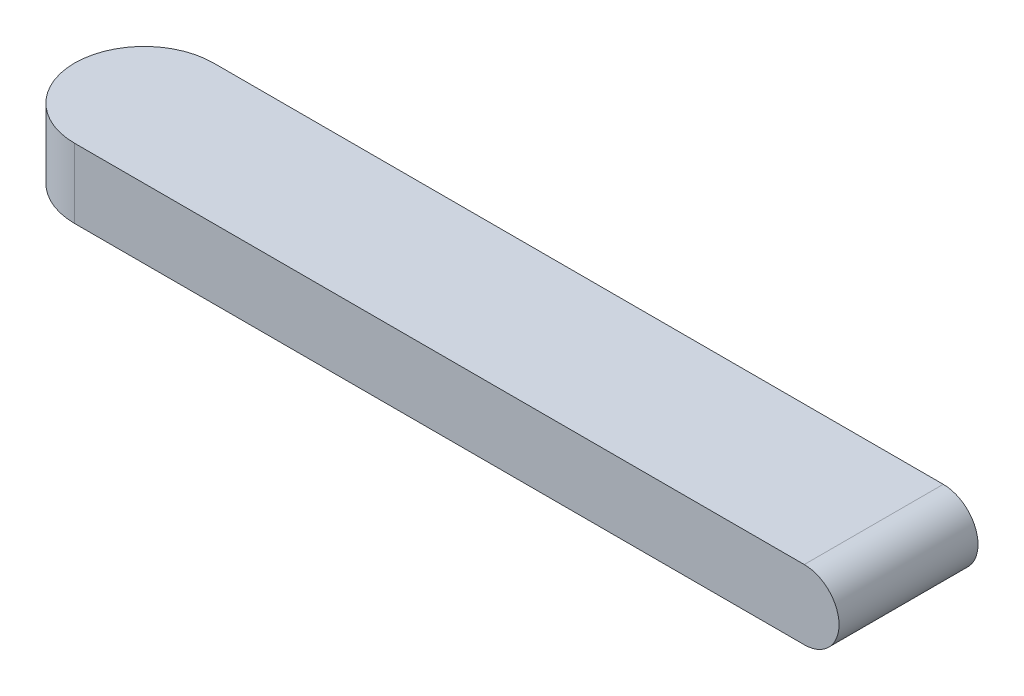
ISO-10303-21;
HEADER;
FILE_DESCRIPTION(('STEP AP214'),'2;1');
FILE_NAME('part.step','',(''),(''),'','','');
FILE_SCHEMA(('AUTOMOTIVE_DESIGN { 1 0 10303 214 1 1 1 1 }'));
ENDSEC;
DATA;
#1=APPLICATION_CONTEXT('core data for automotive mechanical design processes');
#2=APPLICATION_PROTOCOL_DEFINITION('international standard','automotive_design',2000,#1);
#3=PRODUCT_CONTEXT('',#1,'mechanical');
#4=PRODUCT('Part','Part','',(#3));
#5=PRODUCT_RELATED_PRODUCT_CATEGORY('part','',(#4));
#6=PRODUCT_DEFINITION_FORMATION('','',#4);
#7=PRODUCT_DEFINITION_CONTEXT('part definition',#1,'design');
#8=PRODUCT_DEFINITION('design','',#6,#7);
#9=PRODUCT_DEFINITION_SHAPE('','',#8);
#10=(LENGTH_UNIT() NAMED_UNIT(*) SI_UNIT(.MILLI.,.METRE.));
#11=(NAMED_UNIT(*) PLANE_ANGLE_UNIT() SI_UNIT($,.RADIAN.));
#12=(NAMED_UNIT(*) SI_UNIT($,.STERADIAN.) SOLID_ANGLE_UNIT());
#13=UNCERTAINTY_MEASURE_WITH_UNIT(LENGTH_MEASURE(1.E-05),#10,'distance_accuracy_value','');
#14=(GEOMETRIC_REPRESENTATION_CONTEXT(3) GLOBAL_UNCERTAINTY_ASSIGNED_CONTEXT((#13)) GLOBAL_UNIT_ASSIGNED_CONTEXT((#10,
#11,#12)) REPRESENTATION_CONTEXT('',''));
#15=CARTESIAN_POINT('',(0.,0.,0.));
#16=DIRECTION('',(0.,0.,1.));
#17=DIRECTION('',(1.,0.,0.));
#18=AXIS2_PLACEMENT_3D('',#15,#16,#17);
#19=CARTESIAN_POINT('',(5.49999999999999,0.,2.));
#20=DIRECTION('',(0.,0.,-1.));
#21=DIRECTION('',(-1.,0.,0.));
#22=AXIS2_PLACEMENT_3D('',#19,#20,#21);
#23=CYLINDRICAL_SURFACE('',#22,0.5);
#24=DIRECTION('',(0.,0.,-1.));
#25=VECTOR('',#24,1.);
#26=CARTESIAN_POINT('',(5.49999999999999,0.5,2.));
#27=LINE('',#26,#25);
#28=CARTESIAN_POINT('',(5.49999999999999,0.5,2.));
#29=VERTEX_POINT('',#28);
#30=CARTESIAN_POINT('',(5.49999999999999,0.500000000000001,0.));
#31=VERTEX_POINT('',#30);
#32=EDGE_CURVE('E91',#29,#31,#27,.T.);
#33=ORIENTED_EDGE('',*,*,#32,.F.);
#34=CARTESIAN_POINT('',(5.49999999999999,0.,2.));
#35=DIRECTION('',(0.,0.,1.));
#36=DIRECTION('',(1.,0.,0.));
#37=AXIS2_PLACEMENT_3D('',#34,#35,#36);
#38=CIRCLE('',#37,0.5);
#39=CARTESIAN_POINT('',(5.49999999999999,-0.5,2.));
#40=VERTEX_POINT('',#39);
#41=EDGE_CURVE('E50',#40,#29,#38,.T.);
#42=ORIENTED_EDGE('',*,*,#41,.F.);
#43=DIRECTION('',(0.,0.,-1.));
#44=VECTOR('',#43,1.);
#45=CARTESIAN_POINT('',(5.49999999999999,-0.5,2.));
#46=LINE('',#45,#44);
#47=CARTESIAN_POINT('',(5.49999999999999,-0.499999999999999,0.));
#48=VERTEX_POINT('',#47);
#49=EDGE_CURVE('E103',#48,#40,#46,.F.);
#50=ORIENTED_EDGE('',*,*,#49,.F.);
#51=CARTESIAN_POINT('',(5.49999999999999,0.,0.));
#52=DIRECTION('',(0.,0.,1.));
#53=DIRECTION('',(1.,0.,0.));
#54=AXIS2_PLACEMENT_3D('',#51,#52,#53);
#55=CIRCLE('',#54,0.5);
#56=EDGE_CURVE('E13',#31,#48,#55,.F.);
#57=ORIENTED_EDGE('',*,*,#56,.F.);
#58=EDGE_LOOP('',(#33,#42,#50,#57));
#59=FACE_BOUND('',#58,.T.);
#60=ADVANCED_FACE('F43',(#59),#23,.T.);
#61=CARTESIAN_POINT('',(-5.,0.499999999999999,1.));
#62=DIRECTION('',(0.,-1.,0.));
#63=DIRECTION('',(0.,0.,-1.));
#64=AXIS2_PLACEMENT_3D('',#61,#62,#63);
#65=CYLINDRICAL_SURFACE('',#64,1.);
#66=DIRECTION('',(0.,1.,0.));
#67=VECTOR('',#66,1.);
#68=CARTESIAN_POINT('',(-5.,0.5,2.));
#69=LINE('',#68,#67);
#70=CARTESIAN_POINT('',(-5.,0.5,2.));
#71=VERTEX_POINT('',#70);
#72=CARTESIAN_POINT('',(-5.,-0.5,2.));
#73=VERTEX_POINT('',#72);
#74=EDGE_CURVE('E85',#71,#73,#69,.F.);
#75=ORIENTED_EDGE('',*,*,#74,.F.);
#76=CARTESIAN_POINT('',(-5.,0.499999999999999,1.));
#77=DIRECTION('',(0.,-1.,0.));
#78=DIRECTION('',(1.,0.,0.));
#79=AXIS2_PLACEMENT_3D('',#76,#77,#78);
#80=CIRCLE('',#79,1.);
#81=CARTESIAN_POINT('',(-5.,0.499999999999999,0.));
#82=VERTEX_POINT('',#81);
#83=EDGE_CURVE('E92',#82,#71,#80,.F.);
#84=ORIENTED_EDGE('',*,*,#83,.F.);
#85=DIRECTION('',(0.,-1.,0.));
#86=VECTOR('',#85,1.);
#87=CARTESIAN_POINT('',(-5.,0.,0.));
#88=LINE('',#87,#86);
#89=CARTESIAN_POINT('',(-5.,-0.5,0.));
#90=VERTEX_POINT('',#89);
#91=EDGE_CURVE('E87',#90,#82,#88,.F.);
#92=ORIENTED_EDGE('',*,*,#91,.F.);
#93=CARTESIAN_POINT('',(-5.,-0.5,1.));
#94=DIRECTION('',(0.,1.,0.));
#95=DIRECTION('',(-1.,0.,0.));
#96=AXIS2_PLACEMENT_3D('',#93,#94,#95);
#97=CIRCLE('',#96,1.);
#98=EDGE_CURVE('E81',#73,#90,#97,.F.);
#99=ORIENTED_EDGE('',*,*,#98,.F.);
#100=EDGE_LOOP('',(#75,#84,#92,#99));
#101=FACE_BOUND('',#100,.T.);
#102=ADVANCED_FACE('F83',(#101),#65,.T.);
#103=CARTESIAN_POINT('',(6.,-0.499999999999999,2.));
#104=DIRECTION('',(0.,1.,0.));
#105=DIRECTION('',(-1.,0.,0.));
#106=AXIS2_PLACEMENT_3D('',#103,#104,#105);
#107=PLANE('',#106);
#108=DIRECTION('',(1.,0.,0.));
#109=VECTOR('',#108,1.);
#110=CARTESIAN_POINT('',(6.,-0.499999999999999,0.));
#111=LINE('',#110,#109);
#112=EDGE_CURVE('E107',#90,#48,#111,.T.);
#113=ORIENTED_EDGE('',*,*,#112,.T.);
#114=ORIENTED_EDGE('',*,*,#49,.T.);
#115=DIRECTION('',(1.,0.,0.));
#116=VECTOR('',#115,1.);
#117=CARTESIAN_POINT('',(6.,-0.499999999999999,2.));
#118=LINE('',#117,#116);
#119=EDGE_CURVE('E97',#73,#40,#118,.T.);
#120=ORIENTED_EDGE('',*,*,#119,.F.);
#121=ORIENTED_EDGE('',*,*,#98,.T.);
#122=EDGE_LOOP('',(#113,#114,#120,#121));
#123=FACE_BOUND('',#122,.T.);
#124=ADVANCED_FACE('F102',(#123),#107,.F.);
#125=CARTESIAN_POINT('',(6.,0.500000000000001,2.));
#126=DIRECTION('',(0.,-1.,0.));
#127=DIRECTION('',(1.,0.,0.));
#128=AXIS2_PLACEMENT_3D('',#125,#126,#127);
#129=PLANE('',#128);
#130=DIRECTION('',(-1.,0.,0.));
#131=VECTOR('',#130,1.);
#132=CARTESIAN_POINT('',(6.,0.500000000000001,2.));
#133=LINE('',#132,#131);
#134=EDGE_CURVE('E99',#29,#71,#133,.T.);
#135=ORIENTED_EDGE('',*,*,#134,.F.);
#136=ORIENTED_EDGE('',*,*,#32,.T.);
#137=DIRECTION('',(-1.,0.,0.));
#138=VECTOR('',#137,1.);
#139=CARTESIAN_POINT('',(6.,0.500000000000001,0.));
#140=LINE('',#139,#138);
#141=EDGE_CURVE('E104',#31,#82,#140,.T.);
#142=ORIENTED_EDGE('',*,*,#141,.T.);
#143=ORIENTED_EDGE('',*,*,#83,.T.);
#144=EDGE_LOOP('',(#135,#136,#142,#143));
#145=FACE_BOUND('',#144,.T.);
#146=ADVANCED_FACE('F116',(#145),#129,.F.);
#147=CARTESIAN_POINT('',(0.,0.,2.));
#148=DIRECTION('',(0.,0.,1.));
#149=DIRECTION('',(1.,0.,0.));
#150=AXIS2_PLACEMENT_3D('',#147,#148,#149);
#151=PLANE('',#150);
#152=ORIENTED_EDGE('',*,*,#119,.T.);
#153=ORIENTED_EDGE('',*,*,#41,.T.);
#154=ORIENTED_EDGE('',*,*,#134,.T.);
#155=ORIENTED_EDGE('',*,*,#74,.T.);
#156=EDGE_LOOP('',(#152,#153,#154,#155));
#157=FACE_BOUND('',#156,.T.);
#158=ADVANCED_FACE('F96',(#157),#151,.T.);
#159=CARTESIAN_POINT('',(0.,0.,0.));
#160=DIRECTION('',(0.,0.,1.));
#161=DIRECTION('',(1.,0.,0.));
#162=AXIS2_PLACEMENT_3D('',#159,#160,#161);
#163=PLANE('',#162);
#164=ORIENTED_EDGE('',*,*,#141,.F.);
#165=ORIENTED_EDGE('',*,*,#56,.T.);
#166=ORIENTED_EDGE('',*,*,#112,.F.);
#167=ORIENTED_EDGE('',*,*,#91,.T.);
#168=EDGE_LOOP('',(#164,#165,#166,#167));
#169=FACE_BOUND('',#168,.T.);
#170=ADVANCED_FACE('F117',(#169),#163,.F.);
#171=CLOSED_SHELL('',(#60,#102,#124,#146,#158,#170));
#172=MANIFOLD_SOLID_BREP('B2',#171);
#173=ADVANCED_BREP_SHAPE_REPRESENTATION('',(#18,#172),#14);
#174=SHAPE_DEFINITION_REPRESENTATION(#9,#173);
ENDSEC;
END-ISO-10303-21;
